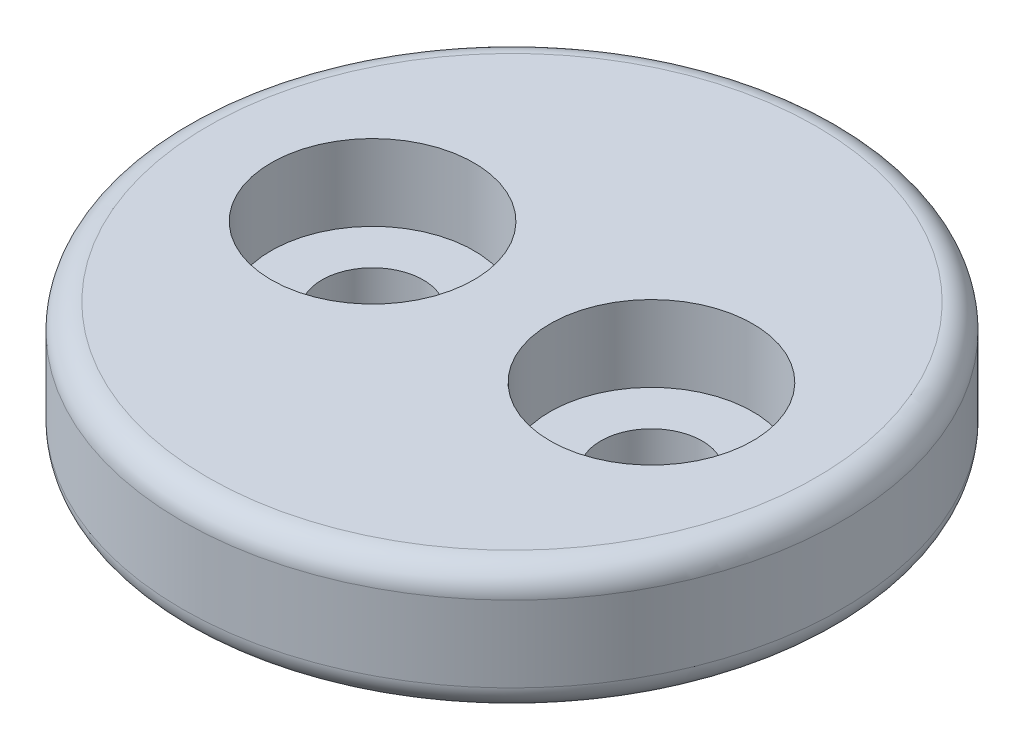
ISO-10303-21;
HEADER;
FILE_DESCRIPTION(('STEP AP214'),'2;1');
FILE_NAME('part.step','',(''),(''),'','','');
FILE_SCHEMA(('AUTOMOTIVE_DESIGN { 1 0 10303 214 1 1 1 1 }'));
ENDSEC;
DATA;
#1=APPLICATION_CONTEXT('core data for automotive mechanical design processes');
#2=APPLICATION_PROTOCOL_DEFINITION('international standard','automotive_design',2000,#1);
#3=PRODUCT_CONTEXT('',#1,'mechanical');
#4=PRODUCT('Part','Part','',(#3));
#5=PRODUCT_RELATED_PRODUCT_CATEGORY('part','',(#4));
#6=PRODUCT_DEFINITION_FORMATION('','',#4);
#7=PRODUCT_DEFINITION_CONTEXT('part definition',#1,'design');
#8=PRODUCT_DEFINITION('design','',#6,#7);
#9=PRODUCT_DEFINITION_SHAPE('','',#8);
#10=(LENGTH_UNIT() NAMED_UNIT(*) SI_UNIT(.MILLI.,.METRE.));
#11=(NAMED_UNIT(*) PLANE_ANGLE_UNIT() SI_UNIT($,.RADIAN.));
#12=(NAMED_UNIT(*) SI_UNIT($,.STERADIAN.) SOLID_ANGLE_UNIT());
#13=UNCERTAINTY_MEASURE_WITH_UNIT(LENGTH_MEASURE(1.E-05),#10,'distance_accuracy_value','');
#14=(GEOMETRIC_REPRESENTATION_CONTEXT(3) GLOBAL_UNCERTAINTY_ASSIGNED_CONTEXT((#13)) GLOBAL_UNIT_ASSIGNED_CONTEXT((#10,
#11,#12)) REPRESENTATION_CONTEXT('',''));
#15=CARTESIAN_POINT('',(0.,0.,0.));
#16=DIRECTION('',(0.,0.,1.));
#17=DIRECTION('',(1.,0.,0.));
#18=AXIS2_PLACEMENT_3D('',#15,#16,#17);
#19=CARTESIAN_POINT('',(-6.9850000000005,6.35,0.));
#20=DIRECTION('',(0.,-1.,0.));
#21=DIRECTION('',(0.,0.,-1.));
#22=AXIS2_PLACEMENT_3D('',#19,#20,#21);
#23=CYLINDRICAL_SURFACE('',#22,2.54000000000051);
#24=CARTESIAN_POINT('',(-6.9850000000005,0.,0.));
#25=DIRECTION('',(0.,1.,0.));
#26=DIRECTION('',(0.,0.,1.));
#27=AXIS2_PLACEMENT_3D('',#24,#25,#26);
#28=CIRCLE('',#27,2.54000000000051);
#29=CARTESIAN_POINT('',(-6.9850000000005,0.,2.5400000000005));
#30=VERTEX_POINT('',#29);
#31=EDGE_CURVE('E65',#30,#30,#28,.T.);
#32=ORIENTED_EDGE('',*,*,#31,.F.);
#33=EDGE_LOOP('',(#32));
#34=FACE_BOUND('',#33,.T.);
#35=CARTESIAN_POINT('',(-6.9850000000005,2.54,0.));
#36=DIRECTION('',(0.,1.,0.));
#37=DIRECTION('',(0.,0.,1.));
#38=AXIS2_PLACEMENT_3D('',#35,#36,#37);
#39=CIRCLE('',#38,2.54000000000051);
#40=CARTESIAN_POINT('',(-6.9850000000005,2.54,2.5400000000005));
#41=VERTEX_POINT('',#40);
#42=EDGE_CURVE('E66',#41,#41,#39,.T.);
#43=ORIENTED_EDGE('',*,*,#42,.T.);
#44=EDGE_LOOP('',(#43));
#45=FACE_BOUND('',#44,.T.);
#46=ADVANCED_FACE('F41',(#34,#45),#23,.F.);
#47=CARTESIAN_POINT('',(6.9850000000005,6.35,0.));
#48=DIRECTION('',(0.,-1.,0.));
#49=DIRECTION('',(0.,0.,-1.));
#50=AXIS2_PLACEMENT_3D('',#47,#48,#49);
#51=CYLINDRICAL_SURFACE('',#50,2.54000000000051);
#52=CARTESIAN_POINT('',(6.9850000000005,0.,0.));
#53=DIRECTION('',(0.,1.,0.));
#54=DIRECTION('',(0.,0.,-1.));
#55=AXIS2_PLACEMENT_3D('',#52,#53,#54);
#56=CIRCLE('',#55,2.54000000000051);
#57=CARTESIAN_POINT('',(6.9850000000005,0.,-2.54000000000054));
#58=VERTEX_POINT('',#57);
#59=EDGE_CURVE('E70',#58,#58,#56,.T.);
#60=ORIENTED_EDGE('',*,*,#59,.F.);
#61=EDGE_LOOP('',(#60));
#62=FACE_BOUND('',#61,.T.);
#63=CARTESIAN_POINT('',(6.9850000000005,2.54,0.));
#64=DIRECTION('',(0.,1.,0.));
#65=DIRECTION('',(0.,0.,1.));
#66=AXIS2_PLACEMENT_3D('',#63,#64,#65);
#67=CIRCLE('',#66,2.54000000000051);
#68=CARTESIAN_POINT('',(6.9850000000005,2.54,2.54000000000049));
#69=VERTEX_POINT('',#68);
#70=EDGE_CURVE('E71',#69,#69,#67,.T.);
#71=ORIENTED_EDGE('',*,*,#70,.T.);
#72=EDGE_LOOP('',(#71));
#73=FACE_BOUND('',#72,.T.);
#74=ADVANCED_FACE('F111',(#62,#73),#51,.F.);
#75=CARTESIAN_POINT('',(0.,6.35,0.));
#76=DIRECTION('',(0.,1.,0.));
#77=DIRECTION('',(0.,0.,1.));
#78=AXIS2_PLACEMENT_3D('',#75,#76,#77);
#79=PLANE('',#78);
#80=CARTESIAN_POINT('',(0.,6.35,0.));
#81=DIRECTION('',(0.,1.,0.));
#82=DIRECTION('',(0.,0.,1.));
#83=AXIS2_PLACEMENT_3D('',#80,#81,#82);
#84=CIRCLE('',#83,15.24);
#85=CARTESIAN_POINT('',(0.,6.35,15.24));
#86=VERTEX_POINT('',#85);
#87=EDGE_CURVE('E10',#86,#86,#84,.T.);
#88=ORIENTED_EDGE('',*,*,#87,.T.);
#89=EDGE_LOOP('',(#88));
#90=FACE_BOUND('',#89,.T.);
#91=CARTESIAN_POINT('',(-6.9850000000005,6.35,0.));
#92=DIRECTION('',(0.,1.,0.));
#93=DIRECTION('',(0.,0.,1.));
#94=AXIS2_PLACEMENT_3D('',#91,#92,#93);
#95=CIRCLE('',#94,5.08);
#96=CARTESIAN_POINT('',(-6.9850000000005,6.35,5.07999999999998));
#97=VERTEX_POINT('',#96);
#98=EDGE_CURVE('E90',#97,#97,#95,.T.);
#99=ORIENTED_EDGE('',*,*,#98,.F.);
#100=EDGE_LOOP('',(#99));
#101=FACE_BOUND('',#100,.T.);
#102=CARTESIAN_POINT('',(6.9850000000005,6.35,0.));
#103=DIRECTION('',(0.,1.,0.));
#104=DIRECTION('',(0.,0.,1.));
#105=AXIS2_PLACEMENT_3D('',#102,#103,#104);
#106=CIRCLE('',#105,5.08);
#107=CARTESIAN_POINT('',(6.9850000000005,6.35,5.07999999999998));
#108=VERTEX_POINT('',#107);
#109=EDGE_CURVE('E86',#108,#108,#106,.T.);
#110=ORIENTED_EDGE('',*,*,#109,.F.);
#111=EDGE_LOOP('',(#110));
#112=FACE_BOUND('',#111,.T.);
#113=ADVANCED_FACE('F107',(#90,#101,#112),#79,.T.);
#114=CARTESIAN_POINT('',(0.,0.,0.));
#115=DIRECTION('',(0.,1.,0.));
#116=DIRECTION('',(0.,0.,1.));
#117=AXIS2_PLACEMENT_3D('',#114,#115,#116);
#118=PLANE('',#117);
#119=CARTESIAN_POINT('',(0.,0.,0.));
#120=DIRECTION('',(0.,1.,0.));
#121=DIRECTION('',(0.,0.,1.));
#122=AXIS2_PLACEMENT_3D('',#119,#120,#121);
#123=CIRCLE('',#122,15.24);
#124=CARTESIAN_POINT('',(0.,0.,15.24));
#125=VERTEX_POINT('',#124);
#126=EDGE_CURVE('E49',#125,#125,#123,.F.);
#127=ORIENTED_EDGE('',*,*,#126,.T.);
#128=EDGE_LOOP('',(#127));
#129=FACE_BOUND('',#128,.T.);
#130=ORIENTED_EDGE('',*,*,#31,.T.);
#131=EDGE_LOOP('',(#130));
#132=FACE_BOUND('',#131,.T.);
#133=ORIENTED_EDGE('',*,*,#59,.T.);
#134=EDGE_LOOP('',(#133));
#135=FACE_BOUND('',#134,.T.);
#136=ADVANCED_FACE('F110',(#129,#132,#135),#118,.F.);
#137=CARTESIAN_POINT('',(0.,6.35,0.));
#138=DIRECTION('',(0.,-1.,0.));
#139=DIRECTION('',(0.,0.,-1.));
#140=AXIS2_PLACEMENT_3D('',#137,#138,#139);
#141=CYLINDRICAL_SURFACE('',#140,16.51);
#142=CARTESIAN_POINT('',(0.,1.27,0.));
#143=DIRECTION('',(0.,1.,0.));
#144=DIRECTION('',(0.,0.,1.));
#145=AXIS2_PLACEMENT_3D('',#142,#143,#144);
#146=CIRCLE('',#145,16.51);
#147=CARTESIAN_POINT('',(0.,1.27,16.51));
#148=VERTEX_POINT('',#147);
#149=EDGE_CURVE('E54',#148,#148,#146,.T.);
#150=ORIENTED_EDGE('',*,*,#149,.T.);
#151=EDGE_LOOP('',(#150));
#152=FACE_BOUND('',#151,.T.);
#153=CARTESIAN_POINT('',(0.,5.08,0.));
#154=DIRECTION('',(0.,1.,0.));
#155=DIRECTION('',(0.,0.,1.));
#156=AXIS2_PLACEMENT_3D('',#153,#154,#155);
#157=CIRCLE('',#156,16.51);
#158=CARTESIAN_POINT('',(0.,5.08,16.51));
#159=VERTEX_POINT('',#158);
#160=EDGE_CURVE('E59',#159,#159,#157,.F.);
#161=ORIENTED_EDGE('',*,*,#160,.T.);
#162=EDGE_LOOP('',(#161));
#163=FACE_BOUND('',#162,.T.);
#164=ADVANCED_FACE('F117',(#152,#163),#141,.T.);
#165=CARTESIAN_POINT('',(6.9850000000005,2.54,0.));
#166=DIRECTION('',(0.,1.,0.));
#167=DIRECTION('',(0.,0.,1.));
#168=AXIS2_PLACEMENT_3D('',#165,#166,#167);
#169=CYLINDRICAL_SURFACE('',#168,5.08);
#170=CARTESIAN_POINT('',(6.9850000000005,2.54,0.));
#171=DIRECTION('',(0.,1.,0.));
#172=DIRECTION('',(0.,0.,1.));
#173=AXIS2_PLACEMENT_3D('',#170,#171,#172);
#174=CIRCLE('',#173,5.08);
#175=CARTESIAN_POINT('',(6.9850000000005,2.54,5.07999999999998));
#176=VERTEX_POINT('',#175);
#177=EDGE_CURVE('E82',#176,#176,#174,.T.);
#178=CARTESIAN_POINT('',(6.9850000000005,2.54,5.07999999999998));
#179=CARTESIAN_POINT('',(6.9850000000005,2.5796875,5.07999999999998));
#180=CARTESIAN_POINT('',(6.9850000000005,2.619375,5.07999999999998));
#181=CARTESIAN_POINT('',(6.9850000000005,2.69875,5.07999999999998));
#182=CARTESIAN_POINT('',(6.9850000000005,2.7384375,5.07999999999998));
#183=CARTESIAN_POINT('',(6.9850000000005,2.8178125,5.07999999999998));
#184=CARTESIAN_POINT('',(6.9850000000005,2.8575,5.07999999999998));
#185=CARTESIAN_POINT('',(6.9850000000005,2.936875,5.07999999999998));
#186=CARTESIAN_POINT('',(6.9850000000005,2.9765625,5.07999999999998));
#187=CARTESIAN_POINT('',(6.9850000000005,3.0559375,5.07999999999998));
#188=CARTESIAN_POINT('',(6.9850000000005,3.095625,5.07999999999998));
#189=CARTESIAN_POINT('',(6.9850000000005,3.175,5.07999999999998));
#190=CARTESIAN_POINT('',(6.9850000000005,3.2146875,5.07999999999998));
#191=CARTESIAN_POINT('',(6.9850000000005,3.2940625,5.07999999999998));
#192=CARTESIAN_POINT('',(6.9850000000005,3.33375,5.07999999999998));
#193=CARTESIAN_POINT('',(6.9850000000005,3.413125,5.07999999999998));
#194=CARTESIAN_POINT('',(6.9850000000005,3.4528125,5.07999999999998));
#195=CARTESIAN_POINT('',(6.9850000000005,3.5321875,5.07999999999998));
#196=CARTESIAN_POINT('',(6.9850000000005,3.571875,5.07999999999998));
#197=CARTESIAN_POINT('',(6.9850000000005,3.65125,5.07999999999998));
#198=CARTESIAN_POINT('',(6.9850000000005,3.6909375,5.07999999999998));
#199=CARTESIAN_POINT('',(6.9850000000005,3.7703125,5.07999999999998));
#200=CARTESIAN_POINT('',(6.9850000000005,3.81,5.07999999999998));
#201=CARTESIAN_POINT('',(6.9850000000005,3.889375,5.07999999999998));
#202=CARTESIAN_POINT('',(6.9850000000005,3.9290625,5.07999999999998));
#203=CARTESIAN_POINT('',(6.9850000000005,4.0084375,5.07999999999998));
#204=CARTESIAN_POINT('',(6.9850000000005,4.048125,5.07999999999998));
#205=CARTESIAN_POINT('',(6.9850000000005,4.1275,5.07999999999998));
#206=CARTESIAN_POINT('',(6.9850000000005,4.1671875,5.07999999999998));
#207=CARTESIAN_POINT('',(6.9850000000005,4.2465625,5.07999999999998));
#208=CARTESIAN_POINT('',(6.9850000000005,4.28625,5.07999999999998));
#209=CARTESIAN_POINT('',(6.9850000000005,4.365625,5.07999999999998));
#210=CARTESIAN_POINT('',(6.9850000000005,4.4053125,5.07999999999998));
#211=CARTESIAN_POINT('',(6.9850000000005,4.4846875,5.07999999999998));
#212=CARTESIAN_POINT('',(6.9850000000005,4.524375,5.07999999999998));
#213=CARTESIAN_POINT('',(6.9850000000005,4.60375,5.07999999999998));
#214=CARTESIAN_POINT('',(6.9850000000005,4.6434375,5.07999999999998));
#215=CARTESIAN_POINT('',(6.9850000000005,4.7228125,5.07999999999998));
#216=CARTESIAN_POINT('',(6.9850000000005,4.7625,5.07999999999998));
#217=CARTESIAN_POINT('',(6.9850000000005,4.841875,5.07999999999998));
#218=CARTESIAN_POINT('',(6.9850000000005,4.8815625,5.07999999999998));
#219=CARTESIAN_POINT('',(6.9850000000005,4.9609375,5.07999999999998));
#220=CARTESIAN_POINT('',(6.9850000000005,5.000625,5.07999999999998));
#221=CARTESIAN_POINT('',(6.9850000000005,5.08,5.07999999999998));
#222=CARTESIAN_POINT('',(6.9850000000005,5.1196875,5.07999999999998));
#223=CARTESIAN_POINT('',(6.9850000000005,5.1990625,5.07999999999998));
#224=CARTESIAN_POINT('',(6.9850000000005,5.23875,5.07999999999998));
#225=CARTESIAN_POINT('',(6.9850000000005,5.318125,5.07999999999998));
#226=CARTESIAN_POINT('',(6.9850000000005,5.3578125,5.07999999999998));
#227=CARTESIAN_POINT('',(6.9850000000005,5.4371875,5.07999999999998));
#228=CARTESIAN_POINT('',(6.9850000000005,5.476875,5.07999999999998));
#229=CARTESIAN_POINT('',(6.9850000000005,5.55625,5.07999999999998));
#230=CARTESIAN_POINT('',(6.9850000000005,5.5959375,5.07999999999998));
#231=CARTESIAN_POINT('',(6.9850000000005,5.6753125,5.07999999999998));
#232=CARTESIAN_POINT('',(6.9850000000005,5.715,5.07999999999998));
#233=CARTESIAN_POINT('',(6.9850000000005,5.794375,5.07999999999998));
#234=CARTESIAN_POINT('',(6.9850000000005,5.8340625,5.07999999999998));
#235=CARTESIAN_POINT('',(6.9850000000005,5.9134375,5.07999999999998));
#236=CARTESIAN_POINT('',(6.9850000000005,5.953125,5.07999999999998));
#237=CARTESIAN_POINT('',(6.9850000000005,6.0325,5.07999999999998));
#238=CARTESIAN_POINT('',(6.9850000000005,6.0721875,5.07999999999998));
#239=CARTESIAN_POINT('',(6.9850000000005,6.1515625,5.07999999999998));
#240=CARTESIAN_POINT('',(6.9850000000005,6.19125,5.07999999999998));
#241=CARTESIAN_POINT('',(6.9850000000005,6.270625,5.07999999999998));
#242=CARTESIAN_POINT('',(6.9850000000005,6.3103125,5.07999999999998));
#243=CARTESIAN_POINT('',(6.9850000000005,6.35,5.07999999999998));
#244=B_SPLINE_CURVE_WITH_KNOTS('',3,(#178,#179,#180,#181,#182,#183,#184,#185,#186,#187,#188,
#189,#190,#191,#192,#193,#194,#195,#196,#197,#198,#199,#200,#201,#202,#203,#204,#205,#206,#207,
#208,#209,#210,#211,#212,#213,#214,#215,#216,#217,#218,#219,#220,#221,#222,#223,#224,#225,#226,
#227,#228,#229,#230,#231,#232,#233,#234,#235,#236,#237,#238,#239,#240,#241,#242,#243),
.UNSPECIFIED.,.F.,.F.,(4,2,2,2,2,2,2,2,2,2,2,2,2,2,2,2,2,2,2,2,2,2,2,2,2,2,2,2,2,2,2,2,4),(0.,
0.1190625,0.238125,0.3571875,0.47625,0.5953125,0.714375,0.8334375,0.9525,1.0715625,1.190625,
1.3096875,1.42875,1.5478125,1.666875,1.7859375,1.905,2.0240625,2.143125,2.2621875,2.38125,
2.5003125,2.619375,2.7384375,2.8575,2.9765625,3.095625,3.2146875,3.33375,3.4528125,3.571875,
3.6909375,3.81),.UNSPECIFIED.);
#245=EDGE_CURVE('BSEAM115',#176,#108,#244,.T.);
#246=ORIENTED_EDGE('',*,*,#177,.F.);
#247=ORIENTED_EDGE('',*,*,#109,.T.);
#248=ORIENTED_EDGE('',*,*,#245,.T.);
#249=ORIENTED_EDGE('',*,*,#245,.F.);
#250=EDGE_LOOP('',(#246,#248,#247,#249));
#251=FACE_BOUND('',#250,.T.);
#252=ADVANCED_FACE('F115',(#251),#169,.F.);
#253=CARTESIAN_POINT('',(6.9850000000005,2.54,0.));
#254=DIRECTION('',(0.,1.,0.));
#255=DIRECTION('',(0.,0.,1.));
#256=AXIS2_PLACEMENT_3D('',#253,#254,#255);
#257=PLANE('',#256);
#258=ORIENTED_EDGE('',*,*,#70,.F.);
#259=EDGE_LOOP('',(#258));
#260=FACE_BOUND('',#259,.T.);
#261=ORIENTED_EDGE('',*,*,#177,.T.);
#262=EDGE_LOOP('',(#261));
#263=FACE_BOUND('',#262,.T.);
#264=ADVANCED_FACE('F103',(#260,#263),#257,.T.);
#265=CARTESIAN_POINT('',(-6.9850000000005,2.54,0.));
#266=DIRECTION('',(0.,1.,0.));
#267=DIRECTION('',(0.,0.,1.));
#268=AXIS2_PLACEMENT_3D('',#265,#266,#267);
#269=CYLINDRICAL_SURFACE('',#268,5.08);
#270=CARTESIAN_POINT('',(-6.9850000000005,2.54,0.));
#271=DIRECTION('',(0.,1.,0.));
#272=DIRECTION('',(0.,0.,1.));
#273=AXIS2_PLACEMENT_3D('',#270,#271,#272);
#274=CIRCLE('',#273,5.08);
#275=CARTESIAN_POINT('',(-6.9850000000005,2.54,5.07999999999998));
#276=VERTEX_POINT('',#275);
#277=EDGE_CURVE('E75',#276,#276,#274,.T.);
#278=CARTESIAN_POINT('',(-6.9850000000005,2.54,5.07999999999998));
#279=CARTESIAN_POINT('',(-6.9850000000005,2.5796875,5.07999999999998));
#280=CARTESIAN_POINT('',(-6.9850000000005,2.619375,5.07999999999998));
#281=CARTESIAN_POINT('',(-6.9850000000005,2.69875,5.07999999999998));
#282=CARTESIAN_POINT('',(-6.9850000000005,2.7384375,5.07999999999998));
#283=CARTESIAN_POINT('',(-6.9850000000005,2.8178125,5.07999999999998));
#284=CARTESIAN_POINT('',(-6.9850000000005,2.8575,5.07999999999998));
#285=CARTESIAN_POINT('',(-6.9850000000005,2.936875,5.07999999999998));
#286=CARTESIAN_POINT('',(-6.9850000000005,2.9765625,5.07999999999998));
#287=CARTESIAN_POINT('',(-6.9850000000005,3.0559375,5.07999999999998));
#288=CARTESIAN_POINT('',(-6.9850000000005,3.095625,5.07999999999998));
#289=CARTESIAN_POINT('',(-6.9850000000005,3.175,5.07999999999998));
#290=CARTESIAN_POINT('',(-6.9850000000005,3.2146875,5.07999999999998));
#291=CARTESIAN_POINT('',(-6.9850000000005,3.2940625,5.07999999999998));
#292=CARTESIAN_POINT('',(-6.9850000000005,3.33375,5.07999999999998));
#293=CARTESIAN_POINT('',(-6.9850000000005,3.413125,5.07999999999998));
#294=CARTESIAN_POINT('',(-6.9850000000005,3.4528125,5.07999999999998));
#295=CARTESIAN_POINT('',(-6.9850000000005,3.5321875,5.07999999999998));
#296=CARTESIAN_POINT('',(-6.9850000000005,3.571875,5.07999999999998));
#297=CARTESIAN_POINT('',(-6.9850000000005,3.65125,5.07999999999998));
#298=CARTESIAN_POINT('',(-6.9850000000005,3.6909375,5.07999999999998));
#299=CARTESIAN_POINT('',(-6.9850000000005,3.7703125,5.07999999999998));
#300=CARTESIAN_POINT('',(-6.9850000000005,3.81,5.07999999999998));
#301=CARTESIAN_POINT('',(-6.9850000000005,3.889375,5.07999999999998));
#302=CARTESIAN_POINT('',(-6.9850000000005,3.9290625,5.07999999999998));
#303=CARTESIAN_POINT('',(-6.9850000000005,4.0084375,5.07999999999998));
#304=CARTESIAN_POINT('',(-6.9850000000005,4.048125,5.07999999999998));
#305=CARTESIAN_POINT('',(-6.9850000000005,4.1275,5.07999999999998));
#306=CARTESIAN_POINT('',(-6.9850000000005,4.1671875,5.07999999999998));
#307=CARTESIAN_POINT('',(-6.9850000000005,4.2465625,5.07999999999998));
#308=CARTESIAN_POINT('',(-6.9850000000005,4.28625,5.07999999999998));
#309=CARTESIAN_POINT('',(-6.9850000000005,4.365625,5.07999999999998));
#310=CARTESIAN_POINT('',(-6.9850000000005,4.4053125,5.07999999999998));
#311=CARTESIAN_POINT('',(-6.9850000000005,4.4846875,5.07999999999998));
#312=CARTESIAN_POINT('',(-6.9850000000005,4.524375,5.07999999999998));
#313=CARTESIAN_POINT('',(-6.9850000000005,4.60375,5.07999999999998));
#314=CARTESIAN_POINT('',(-6.9850000000005,4.6434375,5.07999999999998));
#315=CARTESIAN_POINT('',(-6.9850000000005,4.7228125,5.07999999999998));
#316=CARTESIAN_POINT('',(-6.9850000000005,4.7625,5.07999999999998));
#317=CARTESIAN_POINT('',(-6.9850000000005,4.841875,5.07999999999998));
#318=CARTESIAN_POINT('',(-6.9850000000005,4.8815625,5.07999999999998));
#319=CARTESIAN_POINT('',(-6.9850000000005,4.9609375,5.07999999999998));
#320=CARTESIAN_POINT('',(-6.9850000000005,5.000625,5.07999999999998));
#321=CARTESIAN_POINT('',(-6.9850000000005,5.08,5.07999999999998));
#322=CARTESIAN_POINT('',(-6.9850000000005,5.1196875,5.07999999999998));
#323=CARTESIAN_POINT('',(-6.9850000000005,5.1990625,5.07999999999998));
#324=CARTESIAN_POINT('',(-6.9850000000005,5.23875,5.07999999999998));
#325=CARTESIAN_POINT('',(-6.9850000000005,5.318125,5.07999999999998));
#326=CARTESIAN_POINT('',(-6.9850000000005,5.3578125,5.07999999999998));
#327=CARTESIAN_POINT('',(-6.9850000000005,5.4371875,5.07999999999998));
#328=CARTESIAN_POINT('',(-6.9850000000005,5.476875,5.07999999999998));
#329=CARTESIAN_POINT('',(-6.9850000000005,5.55625,5.07999999999998));
#330=CARTESIAN_POINT('',(-6.9850000000005,5.5959375,5.07999999999998));
#331=CARTESIAN_POINT('',(-6.9850000000005,5.6753125,5.07999999999998));
#332=CARTESIAN_POINT('',(-6.9850000000005,5.715,5.07999999999998));
#333=CARTESIAN_POINT('',(-6.9850000000005,5.794375,5.07999999999998));
#334=CARTESIAN_POINT('',(-6.9850000000005,5.8340625,5.07999999999998));
#335=CARTESIAN_POINT('',(-6.9850000000005,5.9134375,5.07999999999998));
#336=CARTESIAN_POINT('',(-6.9850000000005,5.953125,5.07999999999998));
#337=CARTESIAN_POINT('',(-6.9850000000005,6.0325,5.07999999999998));
#338=CARTESIAN_POINT('',(-6.9850000000005,6.0721875,5.07999999999998));
#339=CARTESIAN_POINT('',(-6.9850000000005,6.1515625,5.07999999999998));
#340=CARTESIAN_POINT('',(-6.9850000000005,6.19125,5.07999999999998));
#341=CARTESIAN_POINT('',(-6.9850000000005,6.270625,5.07999999999998));
#342=CARTESIAN_POINT('',(-6.9850000000005,6.3103125,5.07999999999998));
#343=CARTESIAN_POINT('',(-6.9850000000005,6.35,5.07999999999998));
#344=B_SPLINE_CURVE_WITH_KNOTS('',3,(#278,#279,#280,#281,#282,#283,#284,#285,#286,#287,#288,
#289,#290,#291,#292,#293,#294,#295,#296,#297,#298,#299,#300,#301,#302,#303,#304,#305,#306,#307,
#308,#309,#310,#311,#312,#313,#314,#315,#316,#317,#318,#319,#320,#321,#322,#323,#324,#325,#326,
#327,#328,#329,#330,#331,#332,#333,#334,#335,#336,#337,#338,#339,#340,#341,#342,#343),
.UNSPECIFIED.,.F.,.F.,(4,2,2,2,2,2,2,2,2,2,2,2,2,2,2,2,2,2,2,2,2,2,2,2,2,2,2,2,2,2,2,2,4),(0.,
0.1190625,0.238125,0.3571875,0.47625,0.5953125,0.714375,0.8334375,0.9525,1.0715625,1.190625,
1.3096875,1.42875,1.5478125,1.666875,1.7859375,1.905,2.0240625,2.143125,2.2621875,2.38125,
2.5003125,2.619375,2.7384375,2.8575,2.9765625,3.095625,3.2146875,3.33375,3.4528125,3.571875,
3.6909375,3.81),.UNSPECIFIED.);
#345=EDGE_CURVE('BSEAM100',#276,#97,#344,.T.);
#346=ORIENTED_EDGE('',*,*,#277,.F.);
#347=ORIENTED_EDGE('',*,*,#98,.T.);
#348=ORIENTED_EDGE('',*,*,#345,.T.);
#349=ORIENTED_EDGE('',*,*,#345,.F.);
#350=EDGE_LOOP('',(#346,#348,#347,#349));
#351=FACE_BOUND('',#350,.T.);
#352=ADVANCED_FACE('F100',(#351),#269,.F.);
#353=CARTESIAN_POINT('',(-6.9850000000005,2.54,0.));
#354=DIRECTION('',(0.,1.,0.));
#355=DIRECTION('',(0.,0.,1.));
#356=AXIS2_PLACEMENT_3D('',#353,#354,#355);
#357=PLANE('',#356);
#358=ORIENTED_EDGE('',*,*,#42,.F.);
#359=EDGE_LOOP('',(#358));
#360=FACE_BOUND('',#359,.T.);
#361=ORIENTED_EDGE('',*,*,#277,.T.);
#362=EDGE_LOOP('',(#361));
#363=FACE_BOUND('',#362,.T.);
#364=ADVANCED_FACE('F98',(#360,#363),#357,.T.);
#365=CARTESIAN_POINT('',(0.,1.27,0.));
#366=DIRECTION('',(0.,1.,0.));
#367=DIRECTION('',(0.,0.,1.));
#368=AXIS2_PLACEMENT_3D('',#365,#366,#367);
#369=TOROIDAL_SURFACE('',#368,15.24,1.27);
#370=ORIENTED_EDGE('',*,*,#126,.F.);
#371=EDGE_LOOP('',(#370));
#372=FACE_BOUND('',#371,.T.);
#373=ORIENTED_EDGE('',*,*,#149,.F.);
#374=EDGE_LOOP('',(#373));
#375=FACE_BOUND('',#374,.T.);
#376=ADVANCED_FACE('F141',(#372,#375),#369,.T.);
#377=CARTESIAN_POINT('',(0.,5.08,0.));
#378=DIRECTION('',(0.,1.,0.));
#379=DIRECTION('',(0.,0.,1.));
#380=AXIS2_PLACEMENT_3D('',#377,#378,#379);
#381=TOROIDAL_SURFACE('',#380,15.24,1.27);
#382=ORIENTED_EDGE('',*,*,#160,.F.);
#383=EDGE_LOOP('',(#382));
#384=FACE_BOUND('',#383,.T.);
#385=ORIENTED_EDGE('',*,*,#87,.F.);
#386=EDGE_LOOP('',(#385));
#387=FACE_BOUND('',#386,.T.);
#388=ADVANCED_FACE('F43',(#384,#387),#381,.T.);
#389=CLOSED_SHELL('',(#46,#74,#113,#136,#164,#252,#264,#352,#364,#376,#388));
#390=MANIFOLD_SOLID_BREP('B2',#389);
#391=ADVANCED_BREP_SHAPE_REPRESENTATION('',(#18,#390),#14);
#392=SHAPE_DEFINITION_REPRESENTATION(#9,#391);
ENDSEC;
END-ISO-10303-21;
